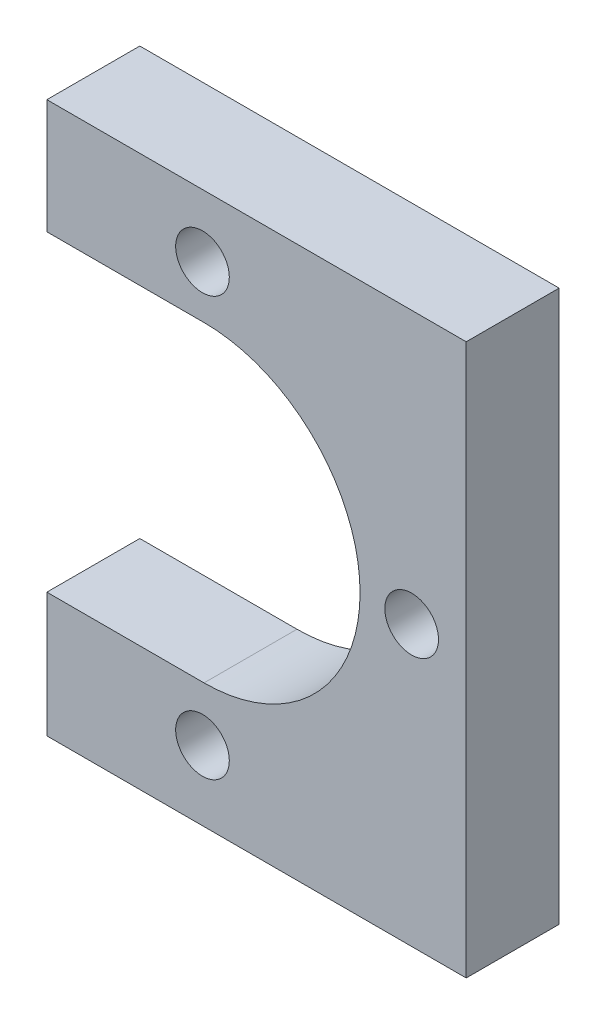
ISO-10303-21;
HEADER;
FILE_DESCRIPTION(('STEP AP214'),'2;1');
FILE_NAME('part.step','',(''),(''),'','','');
FILE_SCHEMA(('AUTOMOTIVE_DESIGN { 1 0 10303 214 1 1 1 1 }'));
ENDSEC;
DATA;
#1=APPLICATION_CONTEXT('core data for automotive mechanical design processes');
#2=APPLICATION_PROTOCOL_DEFINITION('international standard','automotive_design',2000,#1);
#3=PRODUCT_CONTEXT('',#1,'mechanical');
#4=PRODUCT('Part','Part','',(#3));
#5=PRODUCT_RELATED_PRODUCT_CATEGORY('part','',(#4));
#6=PRODUCT_DEFINITION_FORMATION('','',#4);
#7=PRODUCT_DEFINITION_CONTEXT('part definition',#1,'design');
#8=PRODUCT_DEFINITION('design','',#6,#7);
#9=PRODUCT_DEFINITION_SHAPE('','',#8);
#10=(LENGTH_UNIT() NAMED_UNIT(*) SI_UNIT(.MILLI.,.METRE.));
#11=(NAMED_UNIT(*) PLANE_ANGLE_UNIT() SI_UNIT($,.RADIAN.));
#12=(NAMED_UNIT(*) SI_UNIT($,.STERADIAN.) SOLID_ANGLE_UNIT());
#13=UNCERTAINTY_MEASURE_WITH_UNIT(LENGTH_MEASURE(1.E-05),#10,'distance_accuracy_value','');
#14=(GEOMETRIC_REPRESENTATION_CONTEXT(3) GLOBAL_UNCERTAINTY_ASSIGNED_CONTEXT((#13)) GLOBAL_UNIT_ASSIGNED_CONTEXT((#10,
#11,#12)) REPRESENTATION_CONTEXT('',''));
#15=CARTESIAN_POINT('',(0.,0.,0.));
#16=DIRECTION('',(0.,0.,1.));
#17=DIRECTION('',(1.,0.,0.));
#18=AXIS2_PLACEMENT_3D('',#15,#16,#17);
#19=CARTESIAN_POINT('',(-21.5,28.25,9.53));
#20=DIRECTION('',(1.,0.,0.));
#21=DIRECTION('',(0.,1.,0.));
#22=AXIS2_PLACEMENT_3D('',#19,#20,#21);
#23=PLANE('',#22);
#24=DIRECTION('',(0.,0.,1.));
#25=VECTOR('',#24,1.);
#26=CARTESIAN_POINT('',(-21.5,-15.485,0.));
#27=LINE('',#26,#25);
#28=CARTESIAN_POINT('',(-21.5,-15.485,0.));
#29=VERTEX_POINT('',#28);
#30=CARTESIAN_POINT('',(-21.5,-15.485,9.53));
#31=VERTEX_POINT('',#30);
#32=EDGE_CURVE('E137',#29,#31,#27,.T.);
#33=ORIENTED_EDGE('',*,*,#32,.F.);
#34=DIRECTION('',(0.,-1.,0.));
#35=VECTOR('',#34,1.);
#36=CARTESIAN_POINT('',(-21.5,28.25,0.));
#37=LINE('',#36,#35);
#38=CARTESIAN_POINT('',(-21.5,-28.25,0.));
#39=VERTEX_POINT('',#38);
#40=EDGE_CURVE('E125',#29,#39,#37,.T.);
#41=ORIENTED_EDGE('',*,*,#40,.T.);
#42=DIRECTION('',(0.,0.,-1.));
#43=VECTOR('',#42,1.);
#44=CARTESIAN_POINT('',(-21.5,-28.25,9.53));
#45=LINE('',#44,#43);
#46=CARTESIAN_POINT('',(-21.5,-28.25,9.53));
#47=VERTEX_POINT('',#46);
#48=EDGE_CURVE('E11',#47,#39,#45,.T.);
#49=ORIENTED_EDGE('',*,*,#48,.F.);
#50=DIRECTION('',(0.,-1.,0.));
#51=VECTOR('',#50,1.);
#52=CARTESIAN_POINT('',(-21.5,28.25,9.53));
#53=LINE('',#52,#51);
#54=EDGE_CURVE('E83',#31,#47,#53,.T.);
#55=ORIENTED_EDGE('',*,*,#54,.F.);
#56=EDGE_LOOP('',(#33,#41,#49,#55));
#57=FACE_BOUND('',#56,.T.);
#58=ADVANCED_FACE('F31',(#57),#23,.F.);
#59=CARTESIAN_POINT('',(-21.5,-28.25,9.53));
#60=DIRECTION('',(0.,0.,1.));
#61=DIRECTION('',(1.,0.,0.));
#62=AXIS2_PLACEMENT_3D('',#59,#60,#61);
#63=PLANE('',#62);
#64=CARTESIAN_POINT('',(-5.542,-21.105,9.53));
#65=DIRECTION('',(0.,0.,1.));
#66=DIRECTION('',(1.,0.,0.));
#67=AXIS2_PLACEMENT_3D('',#64,#65,#66);
#68=CIRCLE('',#67,2.75);
#69=CARTESIAN_POINT('',(-2.792,-21.105,9.53));
#70=VERTEX_POINT('',#69);
#71=EDGE_CURVE('E223',#70,#70,#68,.T.);
#72=ORIENTED_EDGE('',*,*,#71,.F.);
#73=EDGE_LOOP('',(#72));
#74=FACE_BOUND('',#73,.T.);
#75=CARTESIAN_POINT('',(-5.542,21.833,9.53));
#76=DIRECTION('',(0.,0.,1.));
#77=DIRECTION('',(1.,0.,0.));
#78=AXIS2_PLACEMENT_3D('',#75,#76,#77);
#79=CIRCLE('',#78,2.75);
#80=CARTESIAN_POINT('',(-2.792,21.833,9.53));
#81=VERTEX_POINT('',#80);
#82=EDGE_CURVE('E226',#81,#81,#79,.T.);
#83=ORIENTED_EDGE('',*,*,#82,.F.);
#84=EDGE_LOOP('',(#83));
#85=FACE_BOUND('',#84,.T.);
#86=CARTESIAN_POINT('',(15.908,0.382999999999991,9.53));
#87=DIRECTION('',(0.,0.,1.));
#88=DIRECTION('',(1.,0.,0.));
#89=AXIS2_PLACEMENT_3D('',#86,#87,#88);
#90=CIRCLE('',#89,2.75);
#91=CARTESIAN_POINT('',(18.658,0.382999999999991,9.53));
#92=VERTEX_POINT('',#91);
#93=EDGE_CURVE('E234',#92,#92,#90,.T.);
#94=ORIENTED_EDGE('',*,*,#93,.F.);
#95=EDGE_LOOP('',(#94));
#96=FACE_BOUND('',#95,.T.);
#97=CARTESIAN_POINT('',(-5.384,0.514999999999996,9.53));
#98=DIRECTION('',(0.,0.,1.));
#99=DIRECTION('',(1.,0.,0.));
#100=AXIS2_PLACEMENT_3D('',#97,#98,#99);
#101=CIRCLE('',#100,16.);
#102=CARTESIAN_POINT('',(-5.384,-15.485,9.53));
#103=VERTEX_POINT('',#102);
#104=CARTESIAN_POINT('',(-5.384,16.515,9.53));
#105=VERTEX_POINT('',#104);
#106=EDGE_CURVE('E128',#103,#105,#101,.T.);
#107=ORIENTED_EDGE('',*,*,#106,.F.);
#108=DIRECTION('',(-1.,0.,0.));
#109=VECTOR('',#108,1.);
#110=CARTESIAN_POINT('',(-1.25789978960499,-15.485,9.53));
#111=LINE('',#110,#109);
#112=EDGE_CURVE('E111',#103,#31,#111,.T.);
#113=ORIENTED_EDGE('',*,*,#112,.T.);
#114=ORIENTED_EDGE('',*,*,#54,.T.);
#115=DIRECTION('',(1.,0.,0.));
#116=VECTOR('',#115,1.);
#117=CARTESIAN_POINT('',(-21.5,-28.25,9.53));
#118=LINE('',#117,#116);
#119=CARTESIAN_POINT('',(21.5,-28.25,9.53));
#120=VERTEX_POINT('',#119);
#121=EDGE_CURVE('E145',#47,#120,#118,.T.);
#122=ORIENTED_EDGE('',*,*,#121,.T.);
#123=DIRECTION('',(0.,1.,0.));
#124=VECTOR('',#123,1.);
#125=CARTESIAN_POINT('',(21.5,28.25,9.53));
#126=LINE('',#125,#124);
#127=CARTESIAN_POINT('',(21.5,28.25,9.53));
#128=VERTEX_POINT('',#127);
#129=EDGE_CURVE('E147',#120,#128,#126,.T.);
#130=ORIENTED_EDGE('',*,*,#129,.T.);
#131=DIRECTION('',(-1.,0.,0.));
#132=VECTOR('',#131,1.);
#133=CARTESIAN_POINT('',(-21.5,28.25,9.53));
#134=LINE('',#133,#132);
#135=CARTESIAN_POINT('',(-21.5,28.25,9.53));
#136=VERTEX_POINT('',#135);
#137=EDGE_CURVE('E55',#128,#136,#134,.T.);
#138=ORIENTED_EDGE('',*,*,#137,.T.);
#139=CARTESIAN_POINT('',(-21.5,16.515,9.53));
#140=VERTEX_POINT('',#139);
#141=EDGE_CURVE('E143',#136,#140,#53,.T.);
#142=ORIENTED_EDGE('',*,*,#141,.T.);
#143=DIRECTION('',(-1.,0.,0.));
#144=VECTOR('',#143,1.);
#145=CARTESIAN_POINT('',(-1.25789978960498,16.515,9.53));
#146=LINE('',#145,#144);
#147=EDGE_CURVE('E126',#105,#140,#146,.T.);
#148=ORIENTED_EDGE('',*,*,#147,.F.);
#149=EDGE_LOOP('',(#107,#113,#114,#122,#130,#138,#142,#148));
#150=FACE_BOUND('',#149,.T.);
#151=ADVANCED_FACE('F185',(#74,#85,#96,#150),#63,.T.);
#152=CARTESIAN_POINT('',(-21.5,-28.25,0.));
#153=DIRECTION('',(0.,0.,1.));
#154=DIRECTION('',(1.,0.,0.));
#155=AXIS2_PLACEMENT_3D('',#152,#153,#154);
#156=PLANE('',#155);
#157=CARTESIAN_POINT('',(-5.542,-21.105,0.));
#158=DIRECTION('',(0.,0.,1.));
#159=DIRECTION('',(1.,0.,0.));
#160=AXIS2_PLACEMENT_3D('',#157,#158,#159);
#161=CIRCLE('',#160,2.75);
#162=CARTESIAN_POINT('',(-2.792,-21.105,0.));
#163=VERTEX_POINT('',#162);
#164=EDGE_CURVE('E225',#163,#163,#161,.F.);
#165=ORIENTED_EDGE('',*,*,#164,.F.);
#166=EDGE_LOOP('',(#165));
#167=FACE_BOUND('',#166,.T.);
#168=CARTESIAN_POINT('',(-5.542,21.833,0.));
#169=DIRECTION('',(0.,0.,1.));
#170=DIRECTION('',(1.,0.,0.));
#171=AXIS2_PLACEMENT_3D('',#168,#169,#170);
#172=CIRCLE('',#171,2.75);
#173=CARTESIAN_POINT('',(-2.792,21.833,0.));
#174=VERTEX_POINT('',#173);
#175=EDGE_CURVE('E229',#174,#174,#172,.F.);
#176=ORIENTED_EDGE('',*,*,#175,.F.);
#177=EDGE_LOOP('',(#176));
#178=FACE_BOUND('',#177,.T.);
#179=CARTESIAN_POINT('',(15.908,0.382999999999991,0.));
#180=DIRECTION('',(0.,0.,1.));
#181=DIRECTION('',(1.,0.,0.));
#182=AXIS2_PLACEMENT_3D('',#179,#180,#181);
#183=CIRCLE('',#182,2.75);
#184=CARTESIAN_POINT('',(18.658,0.382999999999991,0.));
#185=VERTEX_POINT('',#184);
#186=EDGE_CURVE('E131',#185,#185,#183,.F.);
#187=ORIENTED_EDGE('',*,*,#186,.F.);
#188=EDGE_LOOP('',(#187));
#189=FACE_BOUND('',#188,.T.);
#190=DIRECTION('',(-1.,0.,0.));
#191=VECTOR('',#190,1.);
#192=CARTESIAN_POINT('',(-1.25789978960499,-15.485,0.));
#193=LINE('',#192,#191);
#194=CARTESIAN_POINT('',(-5.384,-15.485,0.));
#195=VERTEX_POINT('',#194);
#196=EDGE_CURVE('E109',#195,#29,#193,.T.);
#197=ORIENTED_EDGE('',*,*,#196,.F.);
#198=CARTESIAN_POINT('',(-5.384,0.514999999999996,0.));
#199=DIRECTION('',(0.,0.,1.));
#200=DIRECTION('',(1.,0.,0.));
#201=AXIS2_PLACEMENT_3D('',#198,#199,#200);
#202=CIRCLE('',#201,16.);
#203=CARTESIAN_POINT('',(-5.384,16.515,0.));
#204=VERTEX_POINT('',#203);
#205=EDGE_CURVE('E118',#195,#204,#202,.T.);
#206=ORIENTED_EDGE('',*,*,#205,.T.);
#207=DIRECTION('',(-1.,0.,0.));
#208=VECTOR('',#207,1.);
#209=CARTESIAN_POINT('',(-1.25789978960498,16.515,0.));
#210=LINE('',#209,#208);
#211=CARTESIAN_POINT('',(-21.5,16.515,0.));
#212=VERTEX_POINT('',#211);
#213=EDGE_CURVE('E46',#204,#212,#210,.T.);
#214=ORIENTED_EDGE('',*,*,#213,.T.);
#215=CARTESIAN_POINT('',(-21.5,28.25,0.));
#216=VERTEX_POINT('',#215);
#217=EDGE_CURVE('E151',#216,#212,#37,.T.);
#218=ORIENTED_EDGE('',*,*,#217,.F.);
#219=DIRECTION('',(-1.,0.,0.));
#220=VECTOR('',#219,1.);
#221=CARTESIAN_POINT('',(-21.5,28.25,0.));
#222=LINE('',#221,#220);
#223=CARTESIAN_POINT('',(21.5,28.25,0.));
#224=VERTEX_POINT('',#223);
#225=EDGE_CURVE('E76',#224,#216,#222,.T.);
#226=ORIENTED_EDGE('',*,*,#225,.F.);
#227=DIRECTION('',(0.,1.,0.));
#228=VECTOR('',#227,1.);
#229=CARTESIAN_POINT('',(21.5,28.25,0.));
#230=LINE('',#229,#228);
#231=CARTESIAN_POINT('',(21.5,-28.25,0.));
#232=VERTEX_POINT('',#231);
#233=EDGE_CURVE('E156',#232,#224,#230,.T.);
#234=ORIENTED_EDGE('',*,*,#233,.F.);
#235=DIRECTION('',(1.,0.,0.));
#236=VECTOR('',#235,1.);
#237=CARTESIAN_POINT('',(-21.5,-28.25,0.));
#238=LINE('',#237,#236);
#239=EDGE_CURVE('E154',#39,#232,#238,.T.);
#240=ORIENTED_EDGE('',*,*,#239,.F.);
#241=ORIENTED_EDGE('',*,*,#40,.F.);
#242=EDGE_LOOP('',(#197,#206,#214,#218,#226,#234,#240,#241));
#243=FACE_BOUND('',#242,.T.);
#244=ADVANCED_FACE('F123',(#167,#178,#189,#243),#156,.F.);
#245=ORIENTED_EDGE('',*,*,#217,.T.);
#246=DIRECTION('',(0.,0.,1.));
#247=VECTOR('',#246,1.);
#248=CARTESIAN_POINT('',(-21.5,16.515,0.));
#249=LINE('',#248,#247);
#250=EDGE_CURVE('E139',#212,#140,#249,.T.);
#251=ORIENTED_EDGE('',*,*,#250,.T.);
#252=ORIENTED_EDGE('',*,*,#141,.F.);
#253=DIRECTION('',(0.,0.,-1.));
#254=VECTOR('',#253,1.);
#255=CARTESIAN_POINT('',(-21.5,28.25,9.53));
#256=LINE('',#255,#254);
#257=EDGE_CURVE('E150',#136,#216,#256,.T.);
#258=ORIENTED_EDGE('',*,*,#257,.T.);
#259=EDGE_LOOP('',(#245,#251,#252,#258));
#260=FACE_BOUND('',#259,.T.);
#261=ADVANCED_FACE('F33',(#260),#23,.F.);
#262=CARTESIAN_POINT('',(-21.5,-28.25,9.53));
#263=DIRECTION('',(0.,1.,0.));
#264=DIRECTION('',(0.,0.,1.));
#265=AXIS2_PLACEMENT_3D('',#262,#263,#264);
#266=PLANE('',#265);
#267=ORIENTED_EDGE('',*,*,#239,.T.);
#268=DIRECTION('',(0.,0.,-1.));
#269=VECTOR('',#268,1.);
#270=CARTESIAN_POINT('',(21.5,-28.25,9.53));
#271=LINE('',#270,#269);
#272=EDGE_CURVE('E39',#120,#232,#271,.T.);
#273=ORIENTED_EDGE('',*,*,#272,.F.);
#274=ORIENTED_EDGE('',*,*,#121,.F.);
#275=ORIENTED_EDGE('',*,*,#48,.T.);
#276=EDGE_LOOP('',(#267,#273,#274,#275));
#277=FACE_BOUND('',#276,.T.);
#278=ADVANCED_FACE('F181',(#277),#266,.F.);
#279=CARTESIAN_POINT('',(21.5,28.25,9.53));
#280=DIRECTION('',(-1.,0.,0.));
#281=DIRECTION('',(0.,-1.,0.));
#282=AXIS2_PLACEMENT_3D('',#279,#280,#281);
#283=PLANE('',#282);
#284=ORIENTED_EDGE('',*,*,#233,.T.);
#285=DIRECTION('',(0.,0.,-1.));
#286=VECTOR('',#285,1.);
#287=CARTESIAN_POINT('',(21.5,28.25,9.53));
#288=LINE('',#287,#286);
#289=EDGE_CURVE('E160',#128,#224,#288,.T.);
#290=ORIENTED_EDGE('',*,*,#289,.F.);
#291=ORIENTED_EDGE('',*,*,#129,.F.);
#292=ORIENTED_EDGE('',*,*,#272,.T.);
#293=EDGE_LOOP('',(#284,#290,#291,#292));
#294=FACE_BOUND('',#293,.T.);
#295=ADVANCED_FACE('F166',(#294),#283,.F.);
#296=CARTESIAN_POINT('',(-21.5,28.25,9.53));
#297=DIRECTION('',(0.,-1.,0.));
#298=DIRECTION('',(0.,0.,-1.));
#299=AXIS2_PLACEMENT_3D('',#296,#297,#298);
#300=PLANE('',#299);
#301=ORIENTED_EDGE('',*,*,#225,.T.);
#302=ORIENTED_EDGE('',*,*,#257,.F.);
#303=ORIENTED_EDGE('',*,*,#137,.F.);
#304=ORIENTED_EDGE('',*,*,#289,.T.);
#305=EDGE_LOOP('',(#301,#302,#303,#304));
#306=FACE_BOUND('',#305,.T.);
#307=ADVANCED_FACE('F172',(#306),#300,.F.);
#308=CARTESIAN_POINT('',(-1.25789978960499,-15.485,0.));
#309=DIRECTION('',(0.,1.,0.));
#310=DIRECTION('',(-1.,0.,0.));
#311=AXIS2_PLACEMENT_3D('',#308,#309,#310);
#312=PLANE('',#311);
#313=ORIENTED_EDGE('',*,*,#112,.F.);
#314=DIRECTION('',(0.,0.,1.));
#315=VECTOR('',#314,1.);
#316=CARTESIAN_POINT('',(-5.384,-15.485,0.));
#317=LINE('',#316,#315);
#318=EDGE_CURVE('E105',#195,#103,#317,.T.);
#319=ORIENTED_EDGE('',*,*,#318,.F.);
#320=ORIENTED_EDGE('',*,*,#196,.T.);
#321=ORIENTED_EDGE('',*,*,#32,.T.);
#322=EDGE_LOOP('',(#313,#319,#320,#321));
#323=FACE_BOUND('',#322,.T.);
#324=ADVANCED_FACE('F107',(#323),#312,.T.);
#325=CARTESIAN_POINT('',(-1.25789978960498,16.515,0.));
#326=DIRECTION('',(0.,1.,0.));
#327=DIRECTION('',(0.,0.,1.));
#328=AXIS2_PLACEMENT_3D('',#325,#326,#327);
#329=PLANE('',#328);
#330=ORIENTED_EDGE('',*,*,#147,.T.);
#331=ORIENTED_EDGE('',*,*,#250,.F.);
#332=ORIENTED_EDGE('',*,*,#213,.F.);
#333=DIRECTION('',(0.,0.,1.));
#334=VECTOR('',#333,1.);
#335=CARTESIAN_POINT('',(-5.384,16.515,0.));
#336=LINE('',#335,#334);
#337=EDGE_CURVE('E115',#204,#105,#336,.T.);
#338=ORIENTED_EDGE('',*,*,#337,.T.);
#339=EDGE_LOOP('',(#330,#331,#332,#338));
#340=FACE_BOUND('',#339,.T.);
#341=ADVANCED_FACE('F179',(#340),#329,.F.);
#342=CARTESIAN_POINT('',(-5.384,0.514999999999996,0.));
#343=DIRECTION('',(0.,0.,1.));
#344=DIRECTION('',(1.,0.,0.));
#345=AXIS2_PLACEMENT_3D('',#342,#343,#344);
#346=CYLINDRICAL_SURFACE('',#345,16.);
#347=ORIENTED_EDGE('',*,*,#106,.T.);
#348=ORIENTED_EDGE('',*,*,#337,.F.);
#349=ORIENTED_EDGE('',*,*,#205,.F.);
#350=ORIENTED_EDGE('',*,*,#318,.T.);
#351=EDGE_LOOP('',(#347,#348,#349,#350));
#352=FACE_BOUND('',#351,.T.);
#353=ADVANCED_FACE('F119',(#352),#346,.F.);
#354=CARTESIAN_POINT('',(15.908,0.382999999999991,-0.000999999999999265));
#355=DIRECTION('',(0.,0.,1.));
#356=DIRECTION('',(1.,0.,0.));
#357=AXIS2_PLACEMENT_3D('',#354,#355,#356);
#358=CYLINDRICAL_SURFACE('',#357,2.75);
#359=ORIENTED_EDGE('',*,*,#93,.T.);
#360=EDGE_LOOP('',(#359));
#361=FACE_BOUND('',#360,.T.);
#362=ORIENTED_EDGE('',*,*,#186,.T.);
#363=EDGE_LOOP('',(#362));
#364=FACE_BOUND('',#363,.T.);
#365=ADVANCED_FACE('F205',(#361,#364),#358,.F.);
#366=CARTESIAN_POINT('',(-5.542,21.833,-0.000999999999999265));
#367=DIRECTION('',(0.,0.,1.));
#368=DIRECTION('',(1.,0.,0.));
#369=AXIS2_PLACEMENT_3D('',#366,#367,#368);
#370=CYLINDRICAL_SURFACE('',#369,2.75);
#371=ORIENTED_EDGE('',*,*,#82,.T.);
#372=EDGE_LOOP('',(#371));
#373=FACE_BOUND('',#372,.T.);
#374=ORIENTED_EDGE('',*,*,#175,.T.);
#375=EDGE_LOOP('',(#374));
#376=FACE_BOUND('',#375,.T.);
#377=ADVANCED_FACE('F210',(#373,#376),#370,.F.);
#378=CARTESIAN_POINT('',(-5.542,-21.105,-0.000999999999999265));
#379=DIRECTION('',(0.,0.,1.));
#380=DIRECTION('',(1.,0.,0.));
#381=AXIS2_PLACEMENT_3D('',#378,#379,#380);
#382=CYLINDRICAL_SURFACE('',#381,2.75);
#383=ORIENTED_EDGE('',*,*,#71,.T.);
#384=EDGE_LOOP('',(#383));
#385=FACE_BOUND('',#384,.T.);
#386=ORIENTED_EDGE('',*,*,#164,.T.);
#387=EDGE_LOOP('',(#386));
#388=FACE_BOUND('',#387,.T.);
#389=ADVANCED_FACE('F214',(#385,#388),#382,.F.);
#390=CLOSED_SHELL('',(#58,#151,#244,#261,#278,#295,#307,#324,#341,#353,#365,#377,#389));
#391=MANIFOLD_SOLID_BREP('B2',#390);
#392=ADVANCED_BREP_SHAPE_REPRESENTATION('',(#18,#391),#14);
#393=SHAPE_DEFINITION_REPRESENTATION(#9,#392);
ENDSEC;
END-ISO-10303-21;
